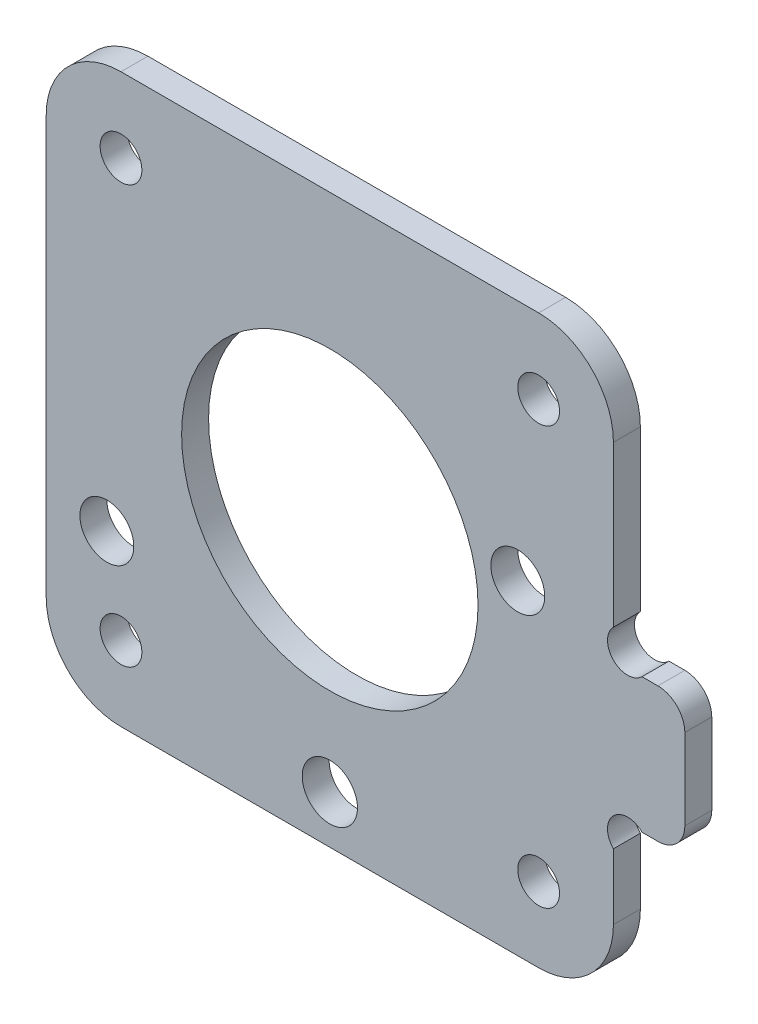
ISO-10303-21;
HEADER;
FILE_DESCRIPTION(('STEP AP214'),'2;1');
FILE_NAME('part.step','',(''),(''),'','','');
FILE_SCHEMA(('AUTOMOTIVE_DESIGN { 1 0 10303 214 1 1 1 1 }'));
ENDSEC;
DATA;
#1=APPLICATION_CONTEXT('core data for automotive mechanical design processes');
#2=APPLICATION_PROTOCOL_DEFINITION('international standard','automotive_design',2000,#1);
#3=PRODUCT_CONTEXT('',#1,'mechanical');
#4=PRODUCT('Part','Part','',(#3));
#5=PRODUCT_RELATED_PRODUCT_CATEGORY('part','',(#4));
#6=PRODUCT_DEFINITION_FORMATION('','',#4);
#7=PRODUCT_DEFINITION_CONTEXT('part definition',#1,'design');
#8=PRODUCT_DEFINITION('design','',#6,#7);
#9=PRODUCT_DEFINITION_SHAPE('','',#8);
#10=(LENGTH_UNIT() NAMED_UNIT(*) SI_UNIT(.MILLI.,.METRE.));
#11=(NAMED_UNIT(*) PLANE_ANGLE_UNIT() SI_UNIT($,.RADIAN.));
#12=(NAMED_UNIT(*) SI_UNIT($,.STERADIAN.) SOLID_ANGLE_UNIT());
#13=UNCERTAINTY_MEASURE_WITH_UNIT(LENGTH_MEASURE(1.E-05),#10,'distance_accuracy_value','');
#14=(GEOMETRIC_REPRESENTATION_CONTEXT(3) GLOBAL_UNCERTAINTY_ASSIGNED_CONTEXT((#13)) GLOBAL_UNIT_ASSIGNED_CONTEXT((#10,
#11,#12)) REPRESENTATION_CONTEXT('',''));
#15=CARTESIAN_POINT('',(0.,0.,0.));
#16=DIRECTION('',(0.,0.,1.));
#17=DIRECTION('',(1.,0.,0.));
#18=AXIS2_PLACEMENT_3D('',#15,#16,#17);
#19=CARTESIAN_POINT('',(21.05,-15.5,2.));
#20=DIRECTION('',(-1.,0.,0.));
#21=DIRECTION('',(0.,0.,1.));
#22=AXIS2_PLACEMENT_3D('',#19,#20,#21);
#23=PLANE('',#22);
#24=DIRECTION('',(0.,1.,0.));
#25=VECTOR('',#24,1.);
#26=CARTESIAN_POINT('',(21.05,-15.5,2.));
#27=LINE('',#26,#25);
#28=CARTESIAN_POINT('',(21.05,3.62132034355964,2.));
#29=VERTEX_POINT('',#28);
#30=CARTESIAN_POINT('',(21.05,15.5,2.));
#31=VERTEX_POINT('',#30);
#32=EDGE_CURVE('E222',#29,#31,#27,.T.);
#33=ORIENTED_EDGE('',*,*,#32,.F.);
#34=DIRECTION('',(0.,0.,1.));
#35=VECTOR('',#34,1.);
#36=CARTESIAN_POINT('',(21.05,3.62132034355964,0.));
#37=LINE('',#36,#35);
#38=CARTESIAN_POINT('',(21.05,3.62132034355964,0.));
#39=VERTEX_POINT('',#38);
#40=EDGE_CURVE('E300',#29,#39,#37,.F.);
#41=ORIENTED_EDGE('',*,*,#40,.T.);
#42=DIRECTION('',(0.,1.,0.));
#43=VECTOR('',#42,1.);
#44=CARTESIAN_POINT('',(21.05,-15.5,0.));
#45=LINE('',#44,#43);
#46=CARTESIAN_POINT('',(21.05,15.5,0.));
#47=VERTEX_POINT('',#46);
#48=EDGE_CURVE('E239',#39,#47,#45,.T.);
#49=ORIENTED_EDGE('',*,*,#48,.T.);
#50=DIRECTION('',(0.,0.,-1.));
#51=VECTOR('',#50,1.);
#52=CARTESIAN_POINT('',(21.05,15.5,2.));
#53=LINE('',#52,#51);
#54=EDGE_CURVE('E251',#31,#47,#53,.T.);
#55=ORIENTED_EDGE('',*,*,#54,.F.);
#56=EDGE_LOOP('',(#33,#41,#49,#55));
#57=FACE_BOUND('',#56,.T.);
#58=ADVANCED_FACE('F32',(#57),#23,.F.);
#59=CARTESIAN_POINT('',(-15.5,15.5,2.));
#60=DIRECTION('',(0.,0.,-1.));
#61=DIRECTION('',(-1.,0.,0.));
#62=AXIS2_PLACEMENT_3D('',#59,#60,#61);
#63=PLANE('',#62);
#64=CARTESIAN_POINT('',(13.95,3.05,2.));
#65=DIRECTION('',(0.,0.,-1.));
#66=DIRECTION('',(-1.,0.,0.));
#67=AXIS2_PLACEMENT_3D('',#64,#65,#66);
#68=CIRCLE('',#67,2.);
#69=CARTESIAN_POINT('',(11.95,3.05,2.));
#70=VERTEX_POINT('',#69);
#71=EDGE_CURVE('E315',#70,#70,#68,.T.);
#72=ORIENTED_EDGE('',*,*,#71,.T.);
#73=EDGE_LOOP('',(#72));
#74=FACE_BOUND('',#73,.T.);
#75=CARTESIAN_POINT('',(-16.55,-9.,2.));
#76=DIRECTION('',(0.,0.,-1.));
#77=DIRECTION('',(-1.,0.,0.));
#78=AXIS2_PLACEMENT_3D('',#75,#76,#77);
#79=CIRCLE('',#78,2.);
#80=CARTESIAN_POINT('',(-18.55,-9.,2.));
#81=VERTEX_POINT('',#80);
#82=EDGE_CURVE('E154',#81,#81,#79,.T.);
#83=ORIENTED_EDGE('',*,*,#82,.T.);
#84=EDGE_LOOP('',(#83));
#85=FACE_BOUND('',#84,.T.);
#86=CARTESIAN_POINT('',(0.,-17.5,2.));
#87=DIRECTION('',(0.,0.,1.));
#88=DIRECTION('',(1.,0.,0.));
#89=AXIS2_PLACEMENT_3D('',#86,#87,#88);
#90=CIRCLE('',#89,2.05);
#91=CARTESIAN_POINT('',(2.05,-17.5,2.));
#92=VERTEX_POINT('',#91);
#93=EDGE_CURVE('E164',#92,#92,#90,.T.);
#94=ORIENTED_EDGE('',*,*,#93,.F.);
#95=EDGE_LOOP('',(#94));
#96=FACE_BOUND('',#95,.T.);
#97=CARTESIAN_POINT('',(15.5,-15.5,2.));
#98=DIRECTION('',(0.,0.,1.));
#99=DIRECTION('',(1.,0.,0.));
#100=AXIS2_PLACEMENT_3D('',#97,#98,#99);
#101=CIRCLE('',#100,1.55);
#102=CARTESIAN_POINT('',(17.05,-15.5,2.));
#103=VERTEX_POINT('',#102);
#104=EDGE_CURVE('E186',#103,#103,#101,.T.);
#105=ORIENTED_EDGE('',*,*,#104,.F.);
#106=EDGE_LOOP('',(#105));
#107=FACE_BOUND('',#106,.T.);
#108=CARTESIAN_POINT('',(-15.5,-15.5,2.));
#109=DIRECTION('',(0.,0.,1.));
#110=DIRECTION('',(1.,0.,0.));
#111=AXIS2_PLACEMENT_3D('',#108,#109,#110);
#112=CIRCLE('',#111,1.55);
#113=CARTESIAN_POINT('',(-13.95,-15.5,2.));
#114=VERTEX_POINT('',#113);
#115=EDGE_CURVE('E198',#114,#114,#112,.T.);
#116=ORIENTED_EDGE('',*,*,#115,.F.);
#117=EDGE_LOOP('',(#116));
#118=FACE_BOUND('',#117,.T.);
#119=CARTESIAN_POINT('',(22.1106601717798,-9.56066017177982,2.));
#120=DIRECTION('',(0.,0.,1.));
#121=DIRECTION('',(1.,0.,0.));
#122=AXIS2_PLACEMENT_3D('',#119,#120,#121);
#123=CIRCLE('',#122,1.5);
#124=CARTESIAN_POINT('',(23.1713203435596,-8.5,2.));
#125=VERTEX_POINT('',#124);
#126=CARTESIAN_POINT('',(21.05,-10.6213203435596,2.));
#127=VERTEX_POINT('',#126);
#128=EDGE_CURVE('E145',#125,#127,#123,.T.);
#129=ORIENTED_EDGE('',*,*,#128,.F.);
#130=DIRECTION('',(1.,0.,0.));
#131=VECTOR('',#130,1.);
#132=CARTESIAN_POINT('',(21.05,-8.5,2.));
#133=LINE('',#132,#131);
#134=CARTESIAN_POINT('',(24.35,-8.5,2.));
#135=VERTEX_POINT('',#134);
#136=EDGE_CURVE('E149',#125,#135,#133,.T.);
#137=ORIENTED_EDGE('',*,*,#136,.T.);
#138=CARTESIAN_POINT('',(24.35,-6.5,2.));
#139=DIRECTION('',(0.,0.,-1.));
#140=DIRECTION('',(-1.,0.,0.));
#141=AXIS2_PLACEMENT_3D('',#138,#139,#140);
#142=CIRCLE('',#141,2.);
#143=CARTESIAN_POINT('',(26.35,-6.5,2.));
#144=VERTEX_POINT('',#143);
#145=EDGE_CURVE('E281',#135,#144,#142,.F.);
#146=ORIENTED_EDGE('',*,*,#145,.T.);
#147=DIRECTION('',(0.,1.,0.));
#148=VECTOR('',#147,1.);
#149=CARTESIAN_POINT('',(26.35,1.5,2.));
#150=LINE('',#149,#148);
#151=CARTESIAN_POINT('',(26.35,-0.5,2.));
#152=VERTEX_POINT('',#151);
#153=EDGE_CURVE('E165',#144,#152,#150,.T.);
#154=ORIENTED_EDGE('',*,*,#153,.T.);
#155=CARTESIAN_POINT('',(24.35,-0.5,2.));
#156=DIRECTION('',(0.,0.,-1.));
#157=DIRECTION('',(-1.,0.,0.));
#158=AXIS2_PLACEMENT_3D('',#155,#156,#157);
#159=CIRCLE('',#158,2.);
#160=CARTESIAN_POINT('',(24.35,1.5,2.));
#161=VERTEX_POINT('',#160);
#162=EDGE_CURVE('E283',#152,#161,#159,.F.);
#163=ORIENTED_EDGE('',*,*,#162,.T.);
#164=DIRECTION('',(-1.,0.,0.));
#165=VECTOR('',#164,1.);
#166=CARTESIAN_POINT('',(21.05,1.5,2.));
#167=LINE('',#166,#165);
#168=CARTESIAN_POINT('',(23.1713203435596,1.5,2.));
#169=VERTEX_POINT('',#168);
#170=EDGE_CURVE('E171',#161,#169,#167,.T.);
#171=ORIENTED_EDGE('',*,*,#170,.T.);
#172=CARTESIAN_POINT('',(22.1106601717798,2.56066017177982,2.));
#173=DIRECTION('',(0.,0.,1.));
#174=DIRECTION('',(1.,0.,0.));
#175=AXIS2_PLACEMENT_3D('',#172,#173,#174);
#176=CIRCLE('',#175,1.5);
#177=EDGE_CURVE('E54',#29,#169,#176,.T.);
#178=ORIENTED_EDGE('',*,*,#177,.F.);
#179=ORIENTED_EDGE('',*,*,#32,.T.);
#180=CARTESIAN_POINT('',(15.5,15.5,2.));
#181=DIRECTION('',(0.,0.,1.));
#182=DIRECTION('',(1.,0.,0.));
#183=AXIS2_PLACEMENT_3D('',#180,#181,#182);
#184=CIRCLE('',#183,5.54999999999999);
#185=CARTESIAN_POINT('',(15.5,21.05,2.));
#186=VERTEX_POINT('',#185);
#187=EDGE_CURVE('E224',#31,#186,#184,.T.);
#188=ORIENTED_EDGE('',*,*,#187,.T.);
#189=DIRECTION('',(-1.,0.,0.));
#190=VECTOR('',#189,1.);
#191=CARTESIAN_POINT('',(15.5,21.05,2.));
#192=LINE('',#191,#190);
#193=CARTESIAN_POINT('',(-15.5,21.05,2.));
#194=VERTEX_POINT('',#193);
#195=EDGE_CURVE('E226',#186,#194,#192,.T.);
#196=ORIENTED_EDGE('',*,*,#195,.T.);
#197=CARTESIAN_POINT('',(-15.5,15.5,2.));
#198=DIRECTION('',(0.,0.,1.));
#199=DIRECTION('',(-1.,0.,0.));
#200=AXIS2_PLACEMENT_3D('',#197,#198,#199);
#201=CIRCLE('',#200,5.54999999999999);
#202=CARTESIAN_POINT('',(-21.05,15.5,2.));
#203=VERTEX_POINT('',#202);
#204=EDGE_CURVE('E210',#194,#203,#201,.T.);
#205=ORIENTED_EDGE('',*,*,#204,.T.);
#206=DIRECTION('',(0.,-1.,0.));
#207=VECTOR('',#206,1.);
#208=CARTESIAN_POINT('',(-21.05,15.5,2.));
#209=LINE('',#208,#207);
#210=CARTESIAN_POINT('',(-21.05,-15.5,2.));
#211=VERTEX_POINT('',#210);
#212=EDGE_CURVE('E213',#203,#211,#209,.T.);
#213=ORIENTED_EDGE('',*,*,#212,.T.);
#214=CARTESIAN_POINT('',(-15.5,-15.5,2.));
#215=DIRECTION('',(0.,0.,1.));
#216=DIRECTION('',(1.,0.,0.));
#217=AXIS2_PLACEMENT_3D('',#214,#215,#216);
#218=CIRCLE('',#217,5.55);
#219=CARTESIAN_POINT('',(-15.5,-21.05,2.));
#220=VERTEX_POINT('',#219);
#221=EDGE_CURVE('E216',#211,#220,#218,.T.);
#222=ORIENTED_EDGE('',*,*,#221,.T.);
#223=DIRECTION('',(1.,0.,0.));
#224=VECTOR('',#223,1.);
#225=CARTESIAN_POINT('',(-15.5,-21.05,2.));
#226=LINE('',#225,#224);
#227=CARTESIAN_POINT('',(15.5,-21.05,2.));
#228=VERTEX_POINT('',#227);
#229=EDGE_CURVE('E218',#220,#228,#226,.T.);
#230=ORIENTED_EDGE('',*,*,#229,.T.);
#231=CARTESIAN_POINT('',(15.5,-15.5,2.));
#232=DIRECTION('',(0.,0.,1.));
#233=DIRECTION('',(1.,0.,0.));
#234=AXIS2_PLACEMENT_3D('',#231,#232,#233);
#235=CIRCLE('',#234,5.55);
#236=CARTESIAN_POINT('',(21.05,-15.5,2.));
#237=VERTEX_POINT('',#236);
#238=EDGE_CURVE('E220',#228,#237,#235,.T.);
#239=ORIENTED_EDGE('',*,*,#238,.T.);
#240=EDGE_CURVE('E152',#237,#127,#27,.T.);
#241=ORIENTED_EDGE('',*,*,#240,.T.);
#242=EDGE_LOOP('',(#129,#137,#146,#154,#163,#171,#178,#179,#188,#196,#205,#213,#222,#230,#239,#241));
#243=FACE_BOUND('',#242,.T.);
#244=CARTESIAN_POINT('',(0.,0.,2.));
#245=DIRECTION('',(0.,0.,1.));
#246=DIRECTION('',(1.,0.,0.));
#247=AXIS2_PLACEMENT_3D('',#244,#245,#246);
#248=CIRCLE('',#247,11.);
#249=CARTESIAN_POINT('',(11.,0.,2.));
#250=VERTEX_POINT('',#249);
#251=EDGE_CURVE('E204',#250,#250,#248,.T.);
#252=ORIENTED_EDGE('',*,*,#251,.F.);
#253=EDGE_LOOP('',(#252));
#254=FACE_BOUND('',#253,.T.);
#255=CARTESIAN_POINT('',(15.5,15.5,2.));
#256=DIRECTION('',(0.,0.,1.));
#257=DIRECTION('',(1.,0.,0.));
#258=AXIS2_PLACEMENT_3D('',#255,#256,#257);
#259=CIRCLE('',#258,1.55);
#260=CARTESIAN_POINT('',(17.05,15.5,2.));
#261=VERTEX_POINT('',#260);
#262=EDGE_CURVE('E192',#261,#261,#259,.T.);
#263=ORIENTED_EDGE('',*,*,#262,.F.);
#264=EDGE_LOOP('',(#263));
#265=FACE_BOUND('',#264,.T.);
#266=CARTESIAN_POINT('',(-15.5,15.5,2.));
#267=DIRECTION('',(0.,0.,1.));
#268=DIRECTION('',(-1.,0.,0.));
#269=AXIS2_PLACEMENT_3D('',#266,#267,#268);
#270=CIRCLE('',#269,1.55);
#271=CARTESIAN_POINT('',(-17.05,15.5,2.));
#272=VERTEX_POINT('',#271);
#273=EDGE_CURVE('E180',#272,#272,#270,.T.);
#274=ORIENTED_EDGE('',*,*,#273,.F.);
#275=EDGE_LOOP('',(#274));
#276=FACE_BOUND('',#275,.T.);
#277=ADVANCED_FACE('F146',(#74,#85,#96,#107,#118,#243,#254,#265,#276),#63,.F.);
#278=CARTESIAN_POINT('',(-15.5,15.5,0.));
#279=DIRECTION('',(0.,0.,-1.));
#280=DIRECTION('',(-1.,0.,0.));
#281=AXIS2_PLACEMENT_3D('',#278,#279,#280);
#282=PLANE('',#281);
#283=CARTESIAN_POINT('',(13.95,3.05,0.));
#284=DIRECTION('',(0.,0.,-1.));
#285=DIRECTION('',(-1.,0.,0.));
#286=AXIS2_PLACEMENT_3D('',#283,#284,#285);
#287=CIRCLE('',#286,2.);
#288=CARTESIAN_POINT('',(11.95,3.05,0.));
#289=VERTEX_POINT('',#288);
#290=EDGE_CURVE('E312',#289,#289,#287,.T.);
#291=ORIENTED_EDGE('',*,*,#290,.F.);
#292=EDGE_LOOP('',(#291));
#293=FACE_BOUND('',#292,.T.);
#294=CARTESIAN_POINT('',(-16.55,-9.,0.));
#295=DIRECTION('',(0.,0.,-1.));
#296=DIRECTION('',(-1.,0.,0.));
#297=AXIS2_PLACEMENT_3D('',#294,#295,#296);
#298=CIRCLE('',#297,2.);
#299=CARTESIAN_POINT('',(-18.55,-9.,0.));
#300=VERTEX_POINT('',#299);
#301=EDGE_CURVE('E309',#300,#300,#298,.T.);
#302=ORIENTED_EDGE('',*,*,#301,.F.);
#303=EDGE_LOOP('',(#302));
#304=FACE_BOUND('',#303,.T.);
#305=DIRECTION('',(-1.,0.,0.));
#306=VECTOR('',#305,1.);
#307=CARTESIAN_POINT('',(21.05,-8.5,0.));
#308=LINE('',#307,#306);
#309=CARTESIAN_POINT('',(24.35,-8.5,0.));
#310=VERTEX_POINT('',#309);
#311=CARTESIAN_POINT('',(23.1713203435596,-8.5,0.));
#312=VERTEX_POINT('',#311);
#313=EDGE_CURVE('E296',#310,#312,#308,.T.);
#314=ORIENTED_EDGE('',*,*,#313,.T.);
#315=CARTESIAN_POINT('',(22.1106601717798,-9.56066017177982,0.));
#316=DIRECTION('',(0.,0.,1.));
#317=DIRECTION('',(1.,0.,0.));
#318=AXIS2_PLACEMENT_3D('',#315,#316,#317);
#319=CIRCLE('',#318,1.5);
#320=CARTESIAN_POINT('',(21.05,-10.6213203435596,0.));
#321=VERTEX_POINT('',#320);
#322=EDGE_CURVE('E46',#312,#321,#319,.T.);
#323=ORIENTED_EDGE('',*,*,#322,.T.);
#324=CARTESIAN_POINT('',(21.05,-15.5,0.));
#325=VERTEX_POINT('',#324);
#326=EDGE_CURVE('E240',#325,#321,#45,.T.);
#327=ORIENTED_EDGE('',*,*,#326,.F.);
#328=CARTESIAN_POINT('',(15.5,-15.5,0.));
#329=DIRECTION('',(0.,0.,1.));
#330=DIRECTION('',(1.,0.,0.));
#331=AXIS2_PLACEMENT_3D('',#328,#329,#330);
#332=CIRCLE('',#331,5.55);
#333=CARTESIAN_POINT('',(15.5,-21.05,0.));
#334=VERTEX_POINT('',#333);
#335=EDGE_CURVE('E237',#334,#325,#332,.T.);
#336=ORIENTED_EDGE('',*,*,#335,.F.);
#337=DIRECTION('',(1.,0.,0.));
#338=VECTOR('',#337,1.);
#339=CARTESIAN_POINT('',(-15.5,-21.05,0.));
#340=LINE('',#339,#338);
#341=CARTESIAN_POINT('',(-15.5,-21.05,0.));
#342=VERTEX_POINT('',#341);
#343=EDGE_CURVE('E235',#342,#334,#340,.T.);
#344=ORIENTED_EDGE('',*,*,#343,.F.);
#345=CARTESIAN_POINT('',(-15.5,-15.5,0.));
#346=DIRECTION('',(0.,0.,1.));
#347=DIRECTION('',(1.,0.,0.));
#348=AXIS2_PLACEMENT_3D('',#345,#346,#347);
#349=CIRCLE('',#348,5.55);
#350=CARTESIAN_POINT('',(-21.05,-15.5,0.));
#351=VERTEX_POINT('',#350);
#352=EDGE_CURVE('E233',#351,#342,#349,.T.);
#353=ORIENTED_EDGE('',*,*,#352,.F.);
#354=DIRECTION('',(0.,-1.,0.));
#355=VECTOR('',#354,1.);
#356=CARTESIAN_POINT('',(-21.05,15.5,0.));
#357=LINE('',#356,#355);
#358=CARTESIAN_POINT('',(-21.05,15.5,0.));
#359=VERTEX_POINT('',#358);
#360=EDGE_CURVE('E231',#359,#351,#357,.T.);
#361=ORIENTED_EDGE('',*,*,#360,.F.);
#362=CARTESIAN_POINT('',(-15.5,15.5,0.));
#363=DIRECTION('',(0.,0.,1.));
#364=DIRECTION('',(-1.,0.,0.));
#365=AXIS2_PLACEMENT_3D('',#362,#363,#364);
#366=CIRCLE('',#365,5.54999999999999);
#367=CARTESIAN_POINT('',(-15.5,21.05,0.));
#368=VERTEX_POINT('',#367);
#369=EDGE_CURVE('E207',#368,#359,#366,.T.);
#370=ORIENTED_EDGE('',*,*,#369,.F.);
#371=DIRECTION('',(-1.,0.,0.));
#372=VECTOR('',#371,1.);
#373=CARTESIAN_POINT('',(15.5,21.05,0.));
#374=LINE('',#373,#372);
#375=CARTESIAN_POINT('',(15.5,21.05,0.));
#376=VERTEX_POINT('',#375);
#377=EDGE_CURVE('E214',#376,#368,#374,.T.);
#378=ORIENTED_EDGE('',*,*,#377,.F.);
#379=CARTESIAN_POINT('',(15.5,15.5,0.));
#380=DIRECTION('',(0.,0.,1.));
#381=DIRECTION('',(1.,0.,0.));
#382=AXIS2_PLACEMENT_3D('',#379,#380,#381);
#383=CIRCLE('',#382,5.54999999999999);
#384=EDGE_CURVE('E243',#47,#376,#383,.T.);
#385=ORIENTED_EDGE('',*,*,#384,.F.);
#386=ORIENTED_EDGE('',*,*,#48,.F.);
#387=CARTESIAN_POINT('',(22.1106601717798,2.56066017177982,0.));
#388=DIRECTION('',(0.,0.,1.));
#389=DIRECTION('',(1.,0.,0.));
#390=AXIS2_PLACEMENT_3D('',#387,#388,#389);
#391=CIRCLE('',#390,1.5);
#392=CARTESIAN_POINT('',(23.1713203435596,1.5,0.));
#393=VERTEX_POINT('',#392);
#394=EDGE_CURVE('E287',#39,#393,#391,.T.);
#395=ORIENTED_EDGE('',*,*,#394,.T.);
#396=DIRECTION('',(1.,0.,0.));
#397=VECTOR('',#396,1.);
#398=CARTESIAN_POINT('',(21.05,1.5,0.));
#399=LINE('',#398,#397);
#400=CARTESIAN_POINT('',(24.35,1.5,0.));
#401=VERTEX_POINT('',#400);
#402=EDGE_CURVE('E175',#393,#401,#399,.T.);
#403=ORIENTED_EDGE('',*,*,#402,.T.);
#404=CARTESIAN_POINT('',(24.35,-0.5,0.));
#405=DIRECTION('',(0.,0.,-1.));
#406=DIRECTION('',(-1.,0.,0.));
#407=AXIS2_PLACEMENT_3D('',#404,#405,#406);
#408=CIRCLE('',#407,2.);
#409=CARTESIAN_POINT('',(26.35,-0.5,0.));
#410=VERTEX_POINT('',#409);
#411=EDGE_CURVE('E274',#401,#410,#408,.T.);
#412=ORIENTED_EDGE('',*,*,#411,.T.);
#413=DIRECTION('',(0.,-1.,0.));
#414=VECTOR('',#413,1.);
#415=CARTESIAN_POINT('',(26.35,1.5,0.));
#416=LINE('',#415,#414);
#417=CARTESIAN_POINT('',(26.35,-6.5,0.));
#418=VERTEX_POINT('',#417);
#419=EDGE_CURVE('E298',#410,#418,#416,.T.);
#420=ORIENTED_EDGE('',*,*,#419,.T.);
#421=CARTESIAN_POINT('',(24.35,-6.5,0.));
#422=DIRECTION('',(0.,0.,-1.));
#423=DIRECTION('',(-1.,0.,0.));
#424=AXIS2_PLACEMENT_3D('',#421,#422,#423);
#425=CIRCLE('',#424,2.);
#426=EDGE_CURVE('E272',#418,#310,#425,.T.);
#427=ORIENTED_EDGE('',*,*,#426,.T.);
#428=EDGE_LOOP('',(#314,#323,#327,#336,#344,#353,#361,#370,#378,#385,#386,#395,#403,#412,#420,#427));
#429=FACE_BOUND('',#428,.T.);
#430=CARTESIAN_POINT('',(0.,-17.5,0.));
#431=DIRECTION('',(0.,0.,1.));
#432=DIRECTION('',(1.,0.,0.));
#433=AXIS2_PLACEMENT_3D('',#430,#431,#432);
#434=CIRCLE('',#433,2.05);
#435=CARTESIAN_POINT('',(2.05,-17.5,0.));
#436=VERTEX_POINT('',#435);
#437=EDGE_CURVE('E168',#436,#436,#434,.T.);
#438=ORIENTED_EDGE('',*,*,#437,.T.);
#439=EDGE_LOOP('',(#438));
#440=FACE_BOUND('',#439,.T.);
#441=CARTESIAN_POINT('',(15.5,-15.5,0.));
#442=DIRECTION('',(0.,0.,1.));
#443=DIRECTION('',(1.,0.,0.));
#444=AXIS2_PLACEMENT_3D('',#441,#442,#443);
#445=CIRCLE('',#444,1.55);
#446=CARTESIAN_POINT('',(17.05,-15.5,0.));
#447=VERTEX_POINT('',#446);
#448=EDGE_CURVE('E183',#447,#447,#445,.T.);
#449=ORIENTED_EDGE('',*,*,#448,.T.);
#450=EDGE_LOOP('',(#449));
#451=FACE_BOUND('',#450,.T.);
#452=CARTESIAN_POINT('',(-15.5,-15.5,0.));
#453=DIRECTION('',(0.,0.,1.));
#454=DIRECTION('',(1.,0.,0.));
#455=AXIS2_PLACEMENT_3D('',#452,#453,#454);
#456=CIRCLE('',#455,1.55);
#457=CARTESIAN_POINT('',(-13.95,-15.5,0.));
#458=VERTEX_POINT('',#457);
#459=EDGE_CURVE('E195',#458,#458,#456,.T.);
#460=ORIENTED_EDGE('',*,*,#459,.T.);
#461=EDGE_LOOP('',(#460));
#462=FACE_BOUND('',#461,.T.);
#463=CARTESIAN_POINT('',(0.,0.,0.));
#464=DIRECTION('',(0.,0.,1.));
#465=DIRECTION('',(1.,0.,0.));
#466=AXIS2_PLACEMENT_3D('',#463,#464,#465);
#467=CIRCLE('',#466,11.);
#468=CARTESIAN_POINT('',(11.,0.,0.));
#469=VERTEX_POINT('',#468);
#470=EDGE_CURVE('E201',#469,#469,#467,.T.);
#471=ORIENTED_EDGE('',*,*,#470,.T.);
#472=EDGE_LOOP('',(#471));
#473=FACE_BOUND('',#472,.T.);
#474=CARTESIAN_POINT('',(15.5,15.5,0.));
#475=DIRECTION('',(0.,0.,1.));
#476=DIRECTION('',(1.,0.,0.));
#477=AXIS2_PLACEMENT_3D('',#474,#475,#476);
#478=CIRCLE('',#477,1.55);
#479=CARTESIAN_POINT('',(17.05,15.5,0.));
#480=VERTEX_POINT('',#479);
#481=EDGE_CURVE('E189',#480,#480,#478,.T.);
#482=ORIENTED_EDGE('',*,*,#481,.T.);
#483=EDGE_LOOP('',(#482));
#484=FACE_BOUND('',#483,.T.);
#485=CARTESIAN_POINT('',(-15.5,15.5,0.));
#486=DIRECTION('',(0.,0.,1.));
#487=DIRECTION('',(-1.,0.,0.));
#488=AXIS2_PLACEMENT_3D('',#485,#486,#487);
#489=CIRCLE('',#488,1.55);
#490=CARTESIAN_POINT('',(-17.05,15.5,0.));
#491=VERTEX_POINT('',#490);
#492=EDGE_CURVE('E178',#491,#491,#489,.T.);
#493=ORIENTED_EDGE('',*,*,#492,.T.);
#494=EDGE_LOOP('',(#493));
#495=FACE_BOUND('',#494,.T.);
#496=ADVANCED_FACE('F323',(#293,#304,#429,#440,#451,#462,#473,#484,#495),#282,.T.);
#497=CARTESIAN_POINT('',(-15.5,15.5,2.));
#498=DIRECTION('',(0.,0.,-1.));
#499=DIRECTION('',(-1.,0.,0.));
#500=AXIS2_PLACEMENT_3D('',#497,#498,#499);
#501=CYLINDRICAL_SURFACE('',#500,5.54999999999999);
#502=ORIENTED_EDGE('',*,*,#369,.T.);
#503=DIRECTION('',(0.,0.,-1.));
#504=VECTOR('',#503,1.);
#505=CARTESIAN_POINT('',(-21.05,15.5,2.));
#506=LINE('',#505,#504);
#507=EDGE_CURVE('E266',#203,#359,#506,.T.);
#508=ORIENTED_EDGE('',*,*,#507,.F.);
#509=ORIENTED_EDGE('',*,*,#204,.F.);
#510=DIRECTION('',(0.,0.,-1.));
#511=VECTOR('',#510,1.);
#512=CARTESIAN_POINT('',(-15.5,21.05,2.));
#513=LINE('',#512,#511);
#514=EDGE_CURVE('E228',#194,#368,#513,.T.);
#515=ORIENTED_EDGE('',*,*,#514,.T.);
#516=EDGE_LOOP('',(#502,#508,#509,#515));
#517=FACE_BOUND('',#516,.T.);
#518=ADVANCED_FACE('F326',(#517),#501,.T.);
#519=CARTESIAN_POINT('',(-21.05,15.5,2.));
#520=DIRECTION('',(1.,0.,0.));
#521=DIRECTION('',(0.,0.,-1.));
#522=AXIS2_PLACEMENT_3D('',#519,#520,#521);
#523=PLANE('',#522);
#524=ORIENTED_EDGE('',*,*,#360,.T.);
#525=DIRECTION('',(0.,0.,-1.));
#526=VECTOR('',#525,1.);
#527=CARTESIAN_POINT('',(-21.05,-15.5,2.));
#528=LINE('',#527,#526);
#529=EDGE_CURVE('E263',#211,#351,#528,.T.);
#530=ORIENTED_EDGE('',*,*,#529,.F.);
#531=ORIENTED_EDGE('',*,*,#212,.F.);
#532=ORIENTED_EDGE('',*,*,#507,.T.);
#533=EDGE_LOOP('',(#524,#530,#531,#532));
#534=FACE_BOUND('',#533,.T.);
#535=ADVANCED_FACE('F400',(#534),#523,.F.);
#536=CARTESIAN_POINT('',(-15.5,-15.5,2.));
#537=DIRECTION('',(0.,0.,-1.));
#538=DIRECTION('',(-1.,0.,0.));
#539=AXIS2_PLACEMENT_3D('',#536,#537,#538);
#540=CYLINDRICAL_SURFACE('',#539,5.55);
#541=ORIENTED_EDGE('',*,*,#352,.T.);
#542=DIRECTION('',(0.,0.,-1.));
#543=VECTOR('',#542,1.);
#544=CARTESIAN_POINT('',(-15.5,-21.05,2.));
#545=LINE('',#544,#543);
#546=EDGE_CURVE('E260',#220,#342,#545,.T.);
#547=ORIENTED_EDGE('',*,*,#546,.F.);
#548=ORIENTED_EDGE('',*,*,#221,.F.);
#549=ORIENTED_EDGE('',*,*,#529,.T.);
#550=EDGE_LOOP('',(#541,#547,#548,#549));
#551=FACE_BOUND('',#550,.T.);
#552=ADVANCED_FACE('F394',(#551),#540,.T.);
#553=CARTESIAN_POINT('',(-15.5,-21.05,2.));
#554=DIRECTION('',(0.,1.,0.));
#555=DIRECTION('',(-1.,0.,0.));
#556=AXIS2_PLACEMENT_3D('',#553,#554,#555);
#557=PLANE('',#556);
#558=ORIENTED_EDGE('',*,*,#343,.T.);
#559=DIRECTION('',(0.,0.,-1.));
#560=VECTOR('',#559,1.);
#561=CARTESIAN_POINT('',(15.5,-21.05,2.));
#562=LINE('',#561,#560);
#563=EDGE_CURVE('E257',#228,#334,#562,.T.);
#564=ORIENTED_EDGE('',*,*,#563,.F.);
#565=ORIENTED_EDGE('',*,*,#229,.F.);
#566=ORIENTED_EDGE('',*,*,#546,.T.);
#567=EDGE_LOOP('',(#558,#564,#565,#566));
#568=FACE_BOUND('',#567,.T.);
#569=ADVANCED_FACE('F380',(#568),#557,.F.);
#570=CARTESIAN_POINT('',(15.5,-15.5,2.));
#571=DIRECTION('',(0.,0.,-1.));
#572=DIRECTION('',(-1.,0.,0.));
#573=AXIS2_PLACEMENT_3D('',#570,#571,#572);
#574=CYLINDRICAL_SURFACE('',#573,5.55);
#575=ORIENTED_EDGE('',*,*,#335,.T.);
#576=DIRECTION('',(0.,0.,-1.));
#577=VECTOR('',#576,1.);
#578=CARTESIAN_POINT('',(21.05,-15.5,2.));
#579=LINE('',#578,#577);
#580=EDGE_CURVE('E254',#237,#325,#579,.T.);
#581=ORIENTED_EDGE('',*,*,#580,.F.);
#582=ORIENTED_EDGE('',*,*,#238,.F.);
#583=ORIENTED_EDGE('',*,*,#563,.T.);
#584=EDGE_LOOP('',(#575,#581,#582,#583));
#585=FACE_BOUND('',#584,.T.);
#586=ADVANCED_FACE('F372',(#585),#574,.T.);
#587=ORIENTED_EDGE('',*,*,#326,.T.);
#588=DIRECTION('',(0.,0.,1.));
#589=VECTOR('',#588,1.);
#590=CARTESIAN_POINT('',(21.05,-10.6213203435596,0.));
#591=LINE('',#590,#589);
#592=EDGE_CURVE('E305',#321,#127,#591,.T.);
#593=ORIENTED_EDGE('',*,*,#592,.T.);
#594=ORIENTED_EDGE('',*,*,#240,.F.);
#595=ORIENTED_EDGE('',*,*,#580,.T.);
#596=EDGE_LOOP('',(#587,#593,#594,#595));
#597=FACE_BOUND('',#596,.T.);
#598=ADVANCED_FACE('F361',(#597),#23,.F.);
#599=CARTESIAN_POINT('',(15.5,15.5,2.));
#600=DIRECTION('',(0.,0.,-1.));
#601=DIRECTION('',(-1.,0.,0.));
#602=AXIS2_PLACEMENT_3D('',#599,#600,#601);
#603=CYLINDRICAL_SURFACE('',#602,5.54999999999999);
#604=ORIENTED_EDGE('',*,*,#384,.T.);
#605=DIRECTION('',(0.,0.,-1.));
#606=VECTOR('',#605,1.);
#607=CARTESIAN_POINT('',(15.5,21.05,2.));
#608=LINE('',#607,#606);
#609=EDGE_CURVE('E248',#186,#376,#608,.T.);
#610=ORIENTED_EDGE('',*,*,#609,.F.);
#611=ORIENTED_EDGE('',*,*,#187,.F.);
#612=ORIENTED_EDGE('',*,*,#54,.T.);
#613=EDGE_LOOP('',(#604,#610,#611,#612));
#614=FACE_BOUND('',#613,.T.);
#615=ADVANCED_FACE('F371',(#614),#603,.T.);
#616=CARTESIAN_POINT('',(15.5,21.05,2.));
#617=DIRECTION('',(0.,-1.,0.));
#618=DIRECTION('',(0.,0.,-1.));
#619=AXIS2_PLACEMENT_3D('',#616,#617,#618);
#620=PLANE('',#619);
#621=ORIENTED_EDGE('',*,*,#377,.T.);
#622=ORIENTED_EDGE('',*,*,#514,.F.);
#623=ORIENTED_EDGE('',*,*,#195,.F.);
#624=ORIENTED_EDGE('',*,*,#609,.T.);
#625=EDGE_LOOP('',(#621,#622,#623,#624));
#626=FACE_BOUND('',#625,.T.);
#627=ADVANCED_FACE('F378',(#626),#620,.F.);
#628=CARTESIAN_POINT('',(0.,0.,2.));
#629=DIRECTION('',(0.,0.,-1.));
#630=DIRECTION('',(-1.,0.,0.));
#631=AXIS2_PLACEMENT_3D('',#628,#629,#630);
#632=CYLINDRICAL_SURFACE('',#631,11.);
#633=ORIENTED_EDGE('',*,*,#251,.T.);
#634=EDGE_LOOP('',(#633));
#635=FACE_BOUND('',#634,.T.);
#636=ORIENTED_EDGE('',*,*,#470,.F.);
#637=EDGE_LOOP('',(#636));
#638=FACE_BOUND('',#637,.T.);
#639=ADVANCED_FACE('F462',(#635,#638),#632,.F.);
#640=CARTESIAN_POINT('',(-15.5,-15.5,2.));
#641=DIRECTION('',(0.,0.,-1.));
#642=DIRECTION('',(-1.,0.,0.));
#643=AXIS2_PLACEMENT_3D('',#640,#641,#642);
#644=CYLINDRICAL_SURFACE('',#643,1.55);
#645=ORIENTED_EDGE('',*,*,#115,.T.);
#646=EDGE_LOOP('',(#645));
#647=FACE_BOUND('',#646,.T.);
#648=ORIENTED_EDGE('',*,*,#459,.F.);
#649=EDGE_LOOP('',(#648));
#650=FACE_BOUND('',#649,.T.);
#651=ADVANCED_FACE('F471',(#647,#650),#644,.F.);
#652=CARTESIAN_POINT('',(15.5,15.5,2.));
#653=DIRECTION('',(0.,0.,-1.));
#654=DIRECTION('',(-1.,0.,0.));
#655=AXIS2_PLACEMENT_3D('',#652,#653,#654);
#656=CYLINDRICAL_SURFACE('',#655,1.55);
#657=ORIENTED_EDGE('',*,*,#262,.T.);
#658=EDGE_LOOP('',(#657));
#659=FACE_BOUND('',#658,.T.);
#660=ORIENTED_EDGE('',*,*,#481,.F.);
#661=EDGE_LOOP('',(#660));
#662=FACE_BOUND('',#661,.T.);
#663=ADVANCED_FACE('F355',(#659,#662),#656,.F.);
#664=CARTESIAN_POINT('',(15.5,-15.5,2.));
#665=DIRECTION('',(0.,0.,-1.));
#666=DIRECTION('',(-1.,0.,0.));
#667=AXIS2_PLACEMENT_3D('',#664,#665,#666);
#668=CYLINDRICAL_SURFACE('',#667,1.55);
#669=ORIENTED_EDGE('',*,*,#104,.T.);
#670=EDGE_LOOP('',(#669));
#671=FACE_BOUND('',#670,.T.);
#672=ORIENTED_EDGE('',*,*,#448,.F.);
#673=EDGE_LOOP('',(#672));
#674=FACE_BOUND('',#673,.T.);
#675=ADVANCED_FACE('F345',(#671,#674),#668,.F.);
#676=CARTESIAN_POINT('',(-15.5,15.5,2.));
#677=DIRECTION('',(0.,0.,-1.));
#678=DIRECTION('',(-1.,0.,0.));
#679=AXIS2_PLACEMENT_3D('',#676,#677,#678);
#680=CYLINDRICAL_SURFACE('',#679,1.55);
#681=ORIENTED_EDGE('',*,*,#273,.T.);
#682=EDGE_LOOP('',(#681));
#683=FACE_BOUND('',#682,.T.);
#684=ORIENTED_EDGE('',*,*,#492,.F.);
#685=EDGE_LOOP('',(#684));
#686=FACE_BOUND('',#685,.T.);
#687=ADVANCED_FACE('F342',(#683,#686),#680,.F.);
#688=CARTESIAN_POINT('',(0.,-17.5,0.));
#689=DIRECTION('',(0.,0.,1.));
#690=DIRECTION('',(1.,0.,0.));
#691=AXIS2_PLACEMENT_3D('',#688,#689,#690);
#692=CYLINDRICAL_SURFACE('',#691,2.05);
#693=ORIENTED_EDGE('',*,*,#437,.F.);
#694=EDGE_LOOP('',(#693));
#695=FACE_BOUND('',#694,.T.);
#696=ORIENTED_EDGE('',*,*,#93,.T.);
#697=EDGE_LOOP('',(#696));
#698=FACE_BOUND('',#697,.T.);
#699=ADVANCED_FACE('F344',(#695,#698),#692,.F.);
#700=CARTESIAN_POINT('',(26.35,1.5,13.317685275709));
#701=DIRECTION('',(1.,0.,0.));
#702=DIRECTION('',(0.,0.,-1.));
#703=AXIS2_PLACEMENT_3D('',#700,#701,#702);
#704=PLANE('',#703);
#705=ORIENTED_EDGE('',*,*,#419,.F.);
#706=DIRECTION('',(0.,0.,-1.));
#707=VECTOR('',#706,1.);
#708=CARTESIAN_POINT('',(26.35,-0.5,13.317685275709));
#709=LINE('',#708,#707);
#710=EDGE_CURVE('E279',#410,#152,#709,.F.);
#711=ORIENTED_EDGE('',*,*,#710,.T.);
#712=ORIENTED_EDGE('',*,*,#153,.F.);
#713=DIRECTION('',(0.,0.,-1.));
#714=VECTOR('',#713,1.);
#715=CARTESIAN_POINT('',(26.35,-6.5,13.317685275709));
#716=LINE('',#715,#714);
#717=EDGE_CURVE('E276',#144,#418,#716,.T.);
#718=ORIENTED_EDGE('',*,*,#717,.T.);
#719=EDGE_LOOP('',(#705,#711,#712,#718));
#720=FACE_BOUND('',#719,.T.);
#721=ADVANCED_FACE('F352',(#720),#704,.T.);
#722=CARTESIAN_POINT('',(21.05,1.5,13.317685275709));
#723=DIRECTION('',(0.,1.,0.));
#724=DIRECTION('',(-1.,0.,0.));
#725=AXIS2_PLACEMENT_3D('',#722,#723,#724);
#726=PLANE('',#725);
#727=DIRECTION('',(0.,0.,1.));
#728=VECTOR('',#727,1.);
#729=CARTESIAN_POINT('',(23.1713203435596,1.5,0.));
#730=LINE('',#729,#728);
#731=EDGE_CURVE('E40',#169,#393,#730,.F.);
#732=ORIENTED_EDGE('',*,*,#731,.F.);
#733=ORIENTED_EDGE('',*,*,#170,.F.);
#734=DIRECTION('',(0.,0.,-1.));
#735=VECTOR('',#734,1.);
#736=CARTESIAN_POINT('',(24.35,1.5,13.317685275709));
#737=LINE('',#736,#735);
#738=EDGE_CURVE('E269',#161,#401,#737,.T.);
#739=ORIENTED_EDGE('',*,*,#738,.T.);
#740=ORIENTED_EDGE('',*,*,#402,.F.);
#741=EDGE_LOOP('',(#732,#733,#739,#740));
#742=FACE_BOUND('',#741,.T.);
#743=ADVANCED_FACE('F292',(#742),#726,.T.);
#744=CARTESIAN_POINT('',(21.05,-8.5,13.317685275709));
#745=DIRECTION('',(0.,-1.,0.));
#746=DIRECTION('',(0.,0.,-1.));
#747=AXIS2_PLACEMENT_3D('',#744,#745,#746);
#748=PLANE('',#747);
#749=DIRECTION('',(0.,0.,1.));
#750=VECTOR('',#749,1.);
#751=CARTESIAN_POINT('',(23.1713203435596,-8.5,0.));
#752=LINE('',#751,#750);
#753=EDGE_CURVE('E11',#312,#125,#752,.T.);
#754=ORIENTED_EDGE('',*,*,#753,.F.);
#755=ORIENTED_EDGE('',*,*,#313,.F.);
#756=DIRECTION('',(0.,0.,-1.));
#757=VECTOR('',#756,1.);
#758=CARTESIAN_POINT('',(24.35,-8.5,13.317685275709));
#759=LINE('',#758,#757);
#760=EDGE_CURVE('E162',#310,#135,#759,.F.);
#761=ORIENTED_EDGE('',*,*,#760,.T.);
#762=ORIENTED_EDGE('',*,*,#136,.F.);
#763=EDGE_LOOP('',(#754,#755,#761,#762));
#764=FACE_BOUND('',#763,.T.);
#765=ADVANCED_FACE('F160',(#764),#748,.T.);
#766=CARTESIAN_POINT('',(24.35,-0.5,13.317685275709));
#767=DIRECTION('',(0.,0.,-1.));
#768=DIRECTION('',(-1.,0.,0.));
#769=AXIS2_PLACEMENT_3D('',#766,#767,#768);
#770=CYLINDRICAL_SURFACE('',#769,2.);
#771=ORIENTED_EDGE('',*,*,#162,.F.);
#772=ORIENTED_EDGE('',*,*,#710,.F.);
#773=ORIENTED_EDGE('',*,*,#411,.F.);
#774=ORIENTED_EDGE('',*,*,#738,.F.);
#775=EDGE_LOOP('',(#771,#772,#773,#774));
#776=FACE_BOUND('',#775,.T.);
#777=ADVANCED_FACE('F413',(#776),#770,.T.);
#778=CARTESIAN_POINT('',(24.35,-6.5,13.317685275709));
#779=DIRECTION('',(0.,0.,-1.));
#780=DIRECTION('',(-1.,0.,0.));
#781=AXIS2_PLACEMENT_3D('',#778,#779,#780);
#782=CYLINDRICAL_SURFACE('',#781,2.);
#783=ORIENTED_EDGE('',*,*,#145,.F.);
#784=ORIENTED_EDGE('',*,*,#760,.F.);
#785=ORIENTED_EDGE('',*,*,#426,.F.);
#786=ORIENTED_EDGE('',*,*,#717,.F.);
#787=EDGE_LOOP('',(#783,#784,#785,#786));
#788=FACE_BOUND('',#787,.T.);
#789=ADVANCED_FACE('F34',(#788),#782,.T.);
#790=CARTESIAN_POINT('',(22.1106601717798,2.56066017177982,0.));
#791=DIRECTION('',(0.,0.,1.));
#792=DIRECTION('',(1.,0.,0.));
#793=AXIS2_PLACEMENT_3D('',#790,#791,#792);
#794=CYLINDRICAL_SURFACE('',#793,1.5);
#795=ORIENTED_EDGE('',*,*,#177,.T.);
#796=ORIENTED_EDGE('',*,*,#731,.T.);
#797=ORIENTED_EDGE('',*,*,#394,.F.);
#798=ORIENTED_EDGE('',*,*,#40,.F.);
#799=EDGE_LOOP('',(#795,#796,#797,#798));
#800=FACE_BOUND('',#799,.T.);
#801=ADVANCED_FACE('F286',(#800),#794,.F.);
#802=CARTESIAN_POINT('',(22.1106601717798,-9.56066017177982,0.));
#803=DIRECTION('',(0.,0.,1.));
#804=DIRECTION('',(1.,0.,0.));
#805=AXIS2_PLACEMENT_3D('',#802,#803,#804);
#806=CYLINDRICAL_SURFACE('',#805,1.5);
#807=ORIENTED_EDGE('',*,*,#322,.F.);
#808=ORIENTED_EDGE('',*,*,#753,.T.);
#809=ORIENTED_EDGE('',*,*,#128,.T.);
#810=ORIENTED_EDGE('',*,*,#592,.F.);
#811=EDGE_LOOP('',(#807,#808,#809,#810));
#812=FACE_BOUND('',#811,.T.);
#813=ADVANCED_FACE('F156',(#812),#806,.F.);
#814=CARTESIAN_POINT('',(-16.55,-9.,2.));
#815=DIRECTION('',(0.,0.,-1.));
#816=DIRECTION('',(-1.,0.,0.));
#817=AXIS2_PLACEMENT_3D('',#814,#815,#816);
#818=CYLINDRICAL_SURFACE('',#817,2.);
#819=ORIENTED_EDGE('',*,*,#82,.F.);
#820=EDGE_LOOP('',(#819));
#821=FACE_BOUND('',#820,.T.);
#822=ORIENTED_EDGE('',*,*,#301,.T.);
#823=EDGE_LOOP('',(#822));
#824=FACE_BOUND('',#823,.T.);
#825=ADVANCED_FACE('F560',(#821,#824),#818,.F.);
#826=CARTESIAN_POINT('',(13.95,3.05,2.));
#827=DIRECTION('',(0.,0.,-1.));
#828=DIRECTION('',(-1.,0.,0.));
#829=AXIS2_PLACEMENT_3D('',#826,#827,#828);
#830=CYLINDRICAL_SURFACE('',#829,2.);
#831=ORIENTED_EDGE('',*,*,#71,.F.);
#832=EDGE_LOOP('',(#831));
#833=FACE_BOUND('',#832,.T.);
#834=ORIENTED_EDGE('',*,*,#290,.T.);
#835=EDGE_LOOP('',(#834));
#836=FACE_BOUND('',#835,.T.);
#837=ADVANCED_FACE('F321',(#833,#836),#830,.F.);
#838=CLOSED_SHELL('',(#58,#277,#496,#518,#535,#552,#569,#586,#598,#615,#627,#639,#651,#663,#675,
#687,#699,#721,#743,#765,#777,#789,#801,#813,#825,#837));
#839=MANIFOLD_SOLID_BREP('B2',#838);
#840=ADVANCED_BREP_SHAPE_REPRESENTATION('',(#18,#839),#14);
#841=SHAPE_DEFINITION_REPRESENTATION(#9,#840);
ENDSEC;
END-ISO-10303-21;
